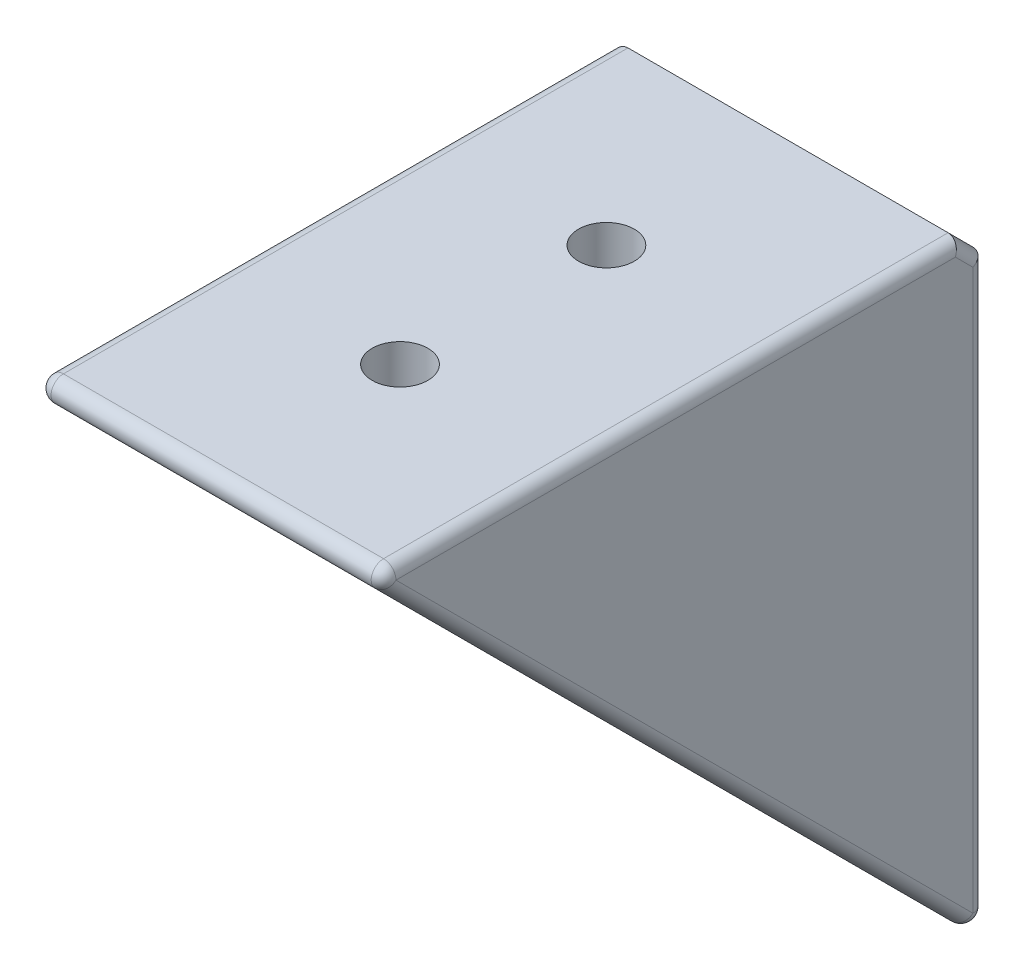
ISO-10303-21;
HEADER;
FILE_DESCRIPTION(('STEP AP214'),'2;1');
FILE_NAME('part.step','',(''),(''),'','','');
FILE_SCHEMA(('AUTOMOTIVE_DESIGN { 1 0 10303 214 1 1 1 1 }'));
ENDSEC;
DATA;
#1=APPLICATION_CONTEXT('core data for automotive mechanical design processes');
#2=APPLICATION_PROTOCOL_DEFINITION('international standard','automotive_design',2000,#1);
#3=PRODUCT_CONTEXT('',#1,'mechanical');
#4=PRODUCT('Part','Part','',(#3));
#5=PRODUCT_RELATED_PRODUCT_CATEGORY('part','',(#4));
#6=PRODUCT_DEFINITION_FORMATION('','',#4);
#7=PRODUCT_DEFINITION_CONTEXT('part definition',#1,'design');
#8=PRODUCT_DEFINITION('design','',#6,#7);
#9=PRODUCT_DEFINITION_SHAPE('','',#8);
#10=(LENGTH_UNIT() NAMED_UNIT(*) SI_UNIT(.MILLI.,.METRE.));
#11=(NAMED_UNIT(*) PLANE_ANGLE_UNIT() SI_UNIT($,.RADIAN.));
#12=(NAMED_UNIT(*) SI_UNIT($,.STERADIAN.) SOLID_ANGLE_UNIT());
#13=UNCERTAINTY_MEASURE_WITH_UNIT(LENGTH_MEASURE(1.E-05),#10,'distance_accuracy_value','');
#14=(GEOMETRIC_REPRESENTATION_CONTEXT(3) GLOBAL_UNCERTAINTY_ASSIGNED_CONTEXT((#13)) GLOBAL_UNIT_ASSIGNED_CONTEXT((#10,
#11,#12)) REPRESENTATION_CONTEXT('',''));
#15=CARTESIAN_POINT('',(0.,0.,0.));
#16=DIRECTION('',(0.,0.,1.));
#17=DIRECTION('',(1.,0.,0.));
#18=AXIS2_PLACEMENT_3D('',#15,#16,#17);
#19=CARTESIAN_POINT('',(13.925,0.,50.));
#20=DIRECTION('',(0.,0.707106781186548,-0.707106781186547));
#21=DIRECTION('',(0.,0.707106781186547,0.707106781186548));
#22=AXIS2_PLACEMENT_3D('',#19,#20,#21);
#23=PLANE('',#22);
#24=DIRECTION('',(0.,-0.707106781186547,-0.707106781186548));
#25=VECTOR('',#24,1.);
#26=CARTESIAN_POINT('',(-12.925,0.,50.));
#27=LINE('',#26,#25);
#28=CARTESIAN_POINT('',(-12.925,-1.70710678118655,48.2928932188135));
#29=VERTEX_POINT('',#28);
#30=CARTESIAN_POINT('',(-12.925,-48.2928932188135,1.70710678118654));
#31=VERTEX_POINT('',#30);
#32=EDGE_CURVE('E215',#29,#31,#27,.T.);
#33=ORIENTED_EDGE('',*,*,#32,.T.);
#34=DIRECTION('',(-1.,0.,0.));
#35=VECTOR('',#34,1.);
#36=CARTESIAN_POINT('',(13.925,-48.2928932188135,1.70710678118655));
#37=LINE('',#36,#35);
#38=CARTESIAN_POINT('',(12.925,-48.2928932188135,1.70710678118654));
#39=VERTEX_POINT('',#38);
#40=EDGE_CURVE('E219',#31,#39,#37,.F.);
#41=ORIENTED_EDGE('',*,*,#40,.T.);
#42=DIRECTION('',(0.,-0.707106781186547,-0.707106781186548));
#43=VECTOR('',#42,1.);
#44=CARTESIAN_POINT('',(12.925,0.,50.));
#45=LINE('',#44,#43);
#46=CARTESIAN_POINT('',(12.925,-1.70710678118655,48.2928932188135));
#47=VERTEX_POINT('',#46);
#48=EDGE_CURVE('E212',#39,#47,#45,.F.);
#49=ORIENTED_EDGE('',*,*,#48,.T.);
#50=DIRECTION('',(-1.,0.,0.));
#51=VECTOR('',#50,1.);
#52=CARTESIAN_POINT('',(13.925,-1.70710678118655,48.2928932188135));
#53=LINE('',#52,#51);
#54=EDGE_CURVE('E209',#47,#29,#53,.T.);
#55=ORIENTED_EDGE('',*,*,#54,.T.);
#56=EDGE_LOOP('',(#33,#41,#49,#55));
#57=FACE_BOUND('',#56,.T.);
#58=DIRECTION('',(0.,-0.707106781186547,-0.707106781186548));
#59=VECTOR('',#58,1.);
#60=CARTESIAN_POINT('',(4.25,-33.3333333333333,16.6666666666667));
#61=LINE('',#60,#59);
#62=CARTESIAN_POINT('',(4.25,-16.6666666666667,33.3333333333333));
#63=VERTEX_POINT('',#62);
#64=CARTESIAN_POINT('',(4.25,-33.3333333333333,16.6666666666667));
#65=VERTEX_POINT('',#64);
#66=EDGE_CURVE('E145',#63,#65,#61,.T.);
#67=ORIENTED_EDGE('',*,*,#66,.T.);
#68=CARTESIAN_POINT('',(0.,-33.3333333333333,16.6666666666667));
#69=DIRECTION('',(0.,0.707106781186548,-0.707106781186547));
#70=DIRECTION('',(0.,-0.707106781186547,-0.707106781186548));
#71=AXIS2_PLACEMENT_3D('',#68,#69,#70);
#72=ELLIPSE('',#71,6.01040764008566,4.25);
#73=CARTESIAN_POINT('',(-4.25,-33.3333333333333,16.6666666666667));
#74=VERTEX_POINT('',#73);
#75=EDGE_CURVE('E159',#65,#74,#72,.T.);
#76=ORIENTED_EDGE('',*,*,#75,.T.);
#77=DIRECTION('',(0.,-0.707106781186547,-0.707106781186548));
#78=VECTOR('',#77,1.);
#79=CARTESIAN_POINT('',(-4.25,-33.3333333333333,16.6666666666667));
#80=LINE('',#79,#78);
#81=CARTESIAN_POINT('',(-4.25,-16.6666666666667,33.3333333333333));
#82=VERTEX_POINT('',#81);
#83=EDGE_CURVE('E327',#82,#74,#80,.T.);
#84=ORIENTED_EDGE('',*,*,#83,.F.);
#85=CARTESIAN_POINT('',(0.,-16.6666666666667,33.3333333333333));
#86=DIRECTION('',(0.,0.707106781186548,-0.707106781186547));
#87=DIRECTION('',(0.,-0.707106781186547,-0.707106781186548));
#88=AXIS2_PLACEMENT_3D('',#85,#86,#87);
#89=ELLIPSE('',#88,6.01040764008566,4.25);
#90=EDGE_CURVE('E161',#82,#63,#89,.T.);
#91=ORIENTED_EDGE('',*,*,#90,.T.);
#92=EDGE_LOOP('',(#67,#76,#84,#91));
#93=FACE_BOUND('',#92,.T.);
#94=ADVANCED_FACE('F47',(#57,#93),#23,.F.);
#95=CARTESIAN_POINT('',(0.,-67.,16.6666666666667));
#96=DIRECTION('',(0.,1.,0.));
#97=DIRECTION('',(0.,0.,1.));
#98=AXIS2_PLACEMENT_3D('',#95,#96,#97);
#99=CYLINDRICAL_SURFACE('',#98,4.25);
#100=CARTESIAN_POINT('',(0.,-33.3333333333333,16.6666666666667));
#101=DIRECTION('',(0.,-0.707106781186547,-0.707106781186548));
#102=DIRECTION('',(0.,0.707106781186548,-0.707106781186547));
#103=AXIS2_PLACEMENT_3D('',#100,#101,#102);
#104=ELLIPSE('',#103,6.01040764008565,4.25);
#105=EDGE_CURVE('E167',#74,#65,#104,.T.);
#106=ORIENTED_EDGE('',*,*,#105,.T.);
#107=DIRECTION('',(0.,1.,0.));
#108=VECTOR('',#107,1.);
#109=CARTESIAN_POINT('',(4.25,-16.6666666666667,16.6666666666667));
#110=LINE('',#109,#108);
#111=CARTESIAN_POINT('',(4.25,-16.6666666666667,16.6666666666667));
#112=VERTEX_POINT('',#111);
#113=EDGE_CURVE('E142',#65,#112,#110,.T.);
#114=ORIENTED_EDGE('',*,*,#113,.T.);
#115=CARTESIAN_POINT('',(0.,-16.6666666666667,16.6666666666667));
#116=DIRECTION('',(0.,0.707106781186548,-0.707106781186547));
#117=DIRECTION('',(0.,-0.707106781186547,-0.707106781186548));
#118=AXIS2_PLACEMENT_3D('',#115,#116,#117);
#119=ELLIPSE('',#118,6.01040764008566,4.25);
#120=CARTESIAN_POINT('',(-4.25,-16.6666666666667,16.6666666666667));
#121=VERTEX_POINT('',#120);
#122=EDGE_CURVE('E348',#112,#121,#119,.T.);
#123=ORIENTED_EDGE('',*,*,#122,.T.);
#124=DIRECTION('',(0.,1.,0.));
#125=VECTOR('',#124,1.);
#126=CARTESIAN_POINT('',(-4.25,-16.6666666666667,16.6666666666667));
#127=LINE('',#126,#125);
#128=EDGE_CURVE('E169',#74,#121,#127,.T.);
#129=ORIENTED_EDGE('',*,*,#128,.F.);
#130=EDGE_LOOP('',(#106,#114,#123,#129));
#131=FACE_BOUND('',#130,.T.);
#132=ADVANCED_FACE('F168',(#131),#99,.F.);
#133=CARTESIAN_POINT('',(0.,-16.6666666666667,67.));
#134=DIRECTION('',(0.,0.,-1.));
#135=DIRECTION('',(-1.,0.,0.));
#136=AXIS2_PLACEMENT_3D('',#133,#134,#135);
#137=CYLINDRICAL_SURFACE('',#136,4.25);
#138=CARTESIAN_POINT('',(0.,-16.6666666666667,16.6666666666667));
#139=DIRECTION('',(0.,0.707106781186548,-0.707106781186547));
#140=DIRECTION('',(0.,-0.707106781186547,-0.707106781186548));
#141=AXIS2_PLACEMENT_3D('',#138,#139,#140);
#142=ELLIPSE('',#141,6.01040764008566,4.25);
#143=EDGE_CURVE('E351',#112,#121,#142,.F.);
#144=ORIENTED_EDGE('',*,*,#143,.F.);
#145=DIRECTION('',(0.,0.,1.));
#146=VECTOR('',#145,1.);
#147=CARTESIAN_POINT('',(4.25,-16.6666666666667,33.3333333333333));
#148=LINE('',#147,#146);
#149=EDGE_CURVE('E147',#112,#63,#148,.T.);
#150=ORIENTED_EDGE('',*,*,#149,.T.);
#151=CARTESIAN_POINT('',(0.,-16.6666666666667,33.3333333333333));
#152=DIRECTION('',(0.,-0.707106781186547,-0.707106781186548));
#153=DIRECTION('',(0.,0.707106781186548,-0.707106781186547));
#154=AXIS2_PLACEMENT_3D('',#151,#152,#153);
#155=ELLIPSE('',#154,6.01040764008565,4.25);
#156=EDGE_CURVE('E172',#82,#63,#155,.T.);
#157=ORIENTED_EDGE('',*,*,#156,.F.);
#158=DIRECTION('',(0.,0.,1.));
#159=VECTOR('',#158,1.);
#160=CARTESIAN_POINT('',(-4.25,-16.6666666666667,33.3333333333333));
#161=LINE('',#160,#159);
#162=EDGE_CURVE('E163',#121,#82,#161,.T.);
#163=ORIENTED_EDGE('',*,*,#162,.F.);
#164=EDGE_LOOP('',(#144,#150,#157,#163));
#165=FACE_BOUND('',#164,.T.);
#166=ADVANCED_FACE('F408',(#165),#137,.F.);
#167=CARTESIAN_POINT('',(0.,-16.6666666666667,5.));
#168=DIRECTION('',(0.,0.,-1.));
#169=DIRECTION('',(-1.,0.,0.));
#170=AXIS2_PLACEMENT_3D('',#167,#168,#169);
#171=CIRCLE('',#170,4.25);
#172=CARTESIAN_POINT('',(-4.25,-16.6666666666667,5.));
#173=VERTEX_POINT('',#172);
#174=EDGE_CURVE('E364',#173,#173,#171,.T.);
#175=ORIENTED_EDGE('',*,*,#174,.T.);
#176=EDGE_LOOP('',(#175));
#177=FACE_BOUND('',#176,.T.);
#178=ORIENTED_EDGE('',*,*,#122,.F.);
#179=CARTESIAN_POINT('',(0.,-16.6666666666667,16.6666666666667));
#180=DIRECTION('',(0.,-0.707106781186547,-0.707106781186548));
#181=DIRECTION('',(0.,0.707106781186548,-0.707106781186547));
#182=AXIS2_PLACEMENT_3D('',#179,#180,#181);
#183=ELLIPSE('',#182,6.01040764008565,4.25);
#184=EDGE_CURVE('E204',#121,#112,#183,.T.);
#185=ORIENTED_EDGE('',*,*,#184,.F.);
#186=EDGE_LOOP('',(#178,#185));
#187=FACE_BOUND('',#186,.T.);
#188=ADVANCED_FACE('F522',(#177,#187),#137,.F.);
#189=CARTESIAN_POINT('',(0.,-33.3333333333333,67.));
#190=DIRECTION('',(0.,0.,-1.));
#191=DIRECTION('',(-1.,0.,0.));
#192=AXIS2_PLACEMENT_3D('',#189,#190,#191);
#193=CYLINDRICAL_SURFACE('',#192,4.25);
#194=CARTESIAN_POINT('',(0.,-33.3333333333333,5.));
#195=DIRECTION('',(0.,0.,-1.));
#196=DIRECTION('',(-1.,0.,0.));
#197=AXIS2_PLACEMENT_3D('',#194,#195,#196);
#198=CIRCLE('',#197,4.25);
#199=CARTESIAN_POINT('',(-4.25,-33.3333333333333,5.));
#200=VERTEX_POINT('',#199);
#201=EDGE_CURVE('E363',#200,#200,#198,.T.);
#202=ORIENTED_EDGE('',*,*,#201,.T.);
#203=EDGE_LOOP('',(#202));
#204=FACE_BOUND('',#203,.T.);
#205=ORIENTED_EDGE('',*,*,#105,.F.);
#206=ORIENTED_EDGE('',*,*,#75,.F.);
#207=EDGE_LOOP('',(#205,#206));
#208=FACE_BOUND('',#207,.T.);
#209=ADVANCED_FACE('F175',(#204,#208),#193,.F.);
#210=CARTESIAN_POINT('',(13.925,0.,0.));
#211=DIRECTION('',(0.,-1.,0.));
#212=DIRECTION('',(0.,0.,-1.));
#213=AXIS2_PLACEMENT_3D('',#210,#211,#212);
#214=PLANE('',#213);
#215=DIRECTION('',(-1.,0.,0.));
#216=VECTOR('',#215,1.);
#217=CARTESIAN_POINT('',(13.925,0.,1.99999999999999));
#218=LINE('',#217,#216);
#219=CARTESIAN_POINT('',(12.925,0.,1.99999999999999));
#220=VERTEX_POINT('',#219);
#221=CARTESIAN_POINT('',(-12.925,0.,1.99999999999999));
#222=VERTEX_POINT('',#221);
#223=EDGE_CURVE('E188',#220,#222,#218,.T.);
#224=ORIENTED_EDGE('',*,*,#223,.T.);
#225=DIRECTION('',(0.,0.,1.));
#226=VECTOR('',#225,1.);
#227=CARTESIAN_POINT('',(-12.925,0.,0.));
#228=LINE('',#227,#226);
#229=CARTESIAN_POINT('',(-12.925,0.,47.5857864376269));
#230=VERTEX_POINT('',#229);
#231=EDGE_CURVE('E257',#222,#230,#228,.T.);
#232=ORIENTED_EDGE('',*,*,#231,.T.);
#233=DIRECTION('',(-1.,0.,0.));
#234=VECTOR('',#233,1.);
#235=CARTESIAN_POINT('',(13.925,0.,47.5857864376269));
#236=LINE('',#235,#234);
#237=CARTESIAN_POINT('',(12.925,0.,47.5857864376269));
#238=VERTEX_POINT('',#237);
#239=EDGE_CURVE('E251',#230,#238,#236,.F.);
#240=ORIENTED_EDGE('',*,*,#239,.T.);
#241=DIRECTION('',(0.,0.,1.));
#242=VECTOR('',#241,1.);
#243=CARTESIAN_POINT('',(12.925,0.,1.99999999999999));
#244=LINE('',#243,#242);
#245=EDGE_CURVE('E254',#238,#220,#244,.F.);
#246=ORIENTED_EDGE('',*,*,#245,.T.);
#247=EDGE_LOOP('',(#224,#232,#240,#246));
#248=FACE_BOUND('',#247,.T.);
#249=CARTESIAN_POINT('',(0.,0.,16.6666666666667));
#250=DIRECTION('',(0.,1.,0.));
#251=DIRECTION('',(0.,0.,1.));
#252=AXIS2_PLACEMENT_3D('',#249,#250,#251);
#253=CIRCLE('',#252,2.24999999999999);
#254=CARTESIAN_POINT('',(0.,0.,18.9166666666667));
#255=VERTEX_POINT('',#254);
#256=EDGE_CURVE('E355',#255,#255,#253,.T.);
#257=ORIENTED_EDGE('',*,*,#256,.F.);
#258=EDGE_LOOP('',(#257));
#259=FACE_BOUND('',#258,.T.);
#260=CARTESIAN_POINT('',(0.,0.,33.3333333333333));
#261=DIRECTION('',(0.,1.,0.));
#262=DIRECTION('',(0.,0.,1.));
#263=AXIS2_PLACEMENT_3D('',#260,#261,#262);
#264=CIRCLE('',#263,2.24999999999999);
#265=CARTESIAN_POINT('',(0.,0.,35.5833333333333));
#266=VERTEX_POINT('',#265);
#267=EDGE_CURVE('E359',#266,#266,#264,.T.);
#268=ORIENTED_EDGE('',*,*,#267,.F.);
#269=EDGE_LOOP('',(#268));
#270=FACE_BOUND('',#269,.T.);
#271=ADVANCED_FACE('F415',(#248,#259,#270),#214,.F.);
#272=CARTESIAN_POINT('',(13.925,-50.,0.));
#273=DIRECTION('',(0.,0.,1.));
#274=DIRECTION('',(1.,0.,0.));
#275=AXIS2_PLACEMENT_3D('',#272,#273,#274);
#276=PLANE('',#275);
#277=DIRECTION('',(-1.,0.,0.));
#278=VECTOR('',#277,1.);
#279=CARTESIAN_POINT('',(13.925,-47.5857864376269,0.));
#280=LINE('',#279,#278);
#281=CARTESIAN_POINT('',(12.925,-47.5857864376269,0.));
#282=VERTEX_POINT('',#281);
#283=CARTESIAN_POINT('',(-12.925,-47.5857864376269,0.));
#284=VERTEX_POINT('',#283);
#285=EDGE_CURVE('E235',#282,#284,#280,.T.);
#286=ORIENTED_EDGE('',*,*,#285,.T.);
#287=DIRECTION('',(0.,1.,0.));
#288=VECTOR('',#287,1.);
#289=CARTESIAN_POINT('',(-12.925,-50.,0.));
#290=LINE('',#289,#288);
#291=CARTESIAN_POINT('',(-12.925,-2.00000000000001,0.));
#292=VERTEX_POINT('',#291);
#293=EDGE_CURVE('E241',#284,#292,#290,.T.);
#294=ORIENTED_EDGE('',*,*,#293,.T.);
#295=DIRECTION('',(1.,0.,0.));
#296=VECTOR('',#295,1.);
#297=CARTESIAN_POINT('',(13.925,-2.00000000000001,0.));
#298=LINE('',#297,#296);
#299=CARTESIAN_POINT('',(12.925,-2.00000000000001,0.));
#300=VERTEX_POINT('',#299);
#301=EDGE_CURVE('E173',#292,#300,#298,.T.);
#302=ORIENTED_EDGE('',*,*,#301,.T.);
#303=DIRECTION('',(0.,1.,0.));
#304=VECTOR('',#303,1.);
#305=CARTESIAN_POINT('',(12.925,-50.,0.));
#306=LINE('',#305,#304);
#307=EDGE_CURVE('E238',#300,#282,#306,.F.);
#308=ORIENTED_EDGE('',*,*,#307,.T.);
#309=EDGE_LOOP('',(#286,#294,#302,#308));
#310=FACE_BOUND('',#309,.T.);
#311=CARTESIAN_POINT('',(0.,-33.3333333333333,0.));
#312=DIRECTION('',(0.,0.,-1.));
#313=DIRECTION('',(-1.,0.,0.));
#314=AXIS2_PLACEMENT_3D('',#311,#312,#313);
#315=CIRCLE('',#314,2.24999999999999);
#316=CARTESIAN_POINT('',(-2.24999999999999,-33.3333333333333,0.));
#317=VERTEX_POINT('',#316);
#318=EDGE_CURVE('E192',#317,#317,#315,.T.);
#319=ORIENTED_EDGE('',*,*,#318,.F.);
#320=EDGE_LOOP('',(#319));
#321=FACE_BOUND('',#320,.T.);
#322=CARTESIAN_POINT('',(0.,-16.6666666666667,0.));
#323=DIRECTION('',(0.,0.,-1.));
#324=DIRECTION('',(-1.,0.,0.));
#325=AXIS2_PLACEMENT_3D('',#322,#323,#324);
#326=CIRCLE('',#325,2.24999999999999);
#327=CARTESIAN_POINT('',(-2.24999999999999,-16.6666666666667,0.));
#328=VERTEX_POINT('',#327);
#329=EDGE_CURVE('E181',#328,#328,#326,.T.);
#330=ORIENTED_EDGE('',*,*,#329,.F.);
#331=EDGE_LOOP('',(#330));
#332=FACE_BOUND('',#331,.T.);
#333=ADVANCED_FACE('F417',(#310,#321,#332),#276,.F.);
#334=CARTESIAN_POINT('',(13.925,0.,0.));
#335=DIRECTION('',(1.,0.,0.));
#336=DIRECTION('',(0.,0.,-1.));
#337=AXIS2_PLACEMENT_3D('',#334,#335,#336);
#338=PLANE('',#337);
#339=DIRECTION('',(0.,0.,1.));
#340=VECTOR('',#339,1.);
#341=CARTESIAN_POINT('',(13.925,-1.00000000000001,50.));
#342=LINE('',#341,#340);
#343=CARTESIAN_POINT('',(13.925,-1.,2.41421356237309));
#344=VERTEX_POINT('',#343);
#345=CARTESIAN_POINT('',(13.925,-1.00000000000001,47.5857864376269));
#346=VERTEX_POINT('',#345);
#347=EDGE_CURVE('E57',#344,#346,#342,.T.);
#348=ORIENTED_EDGE('',*,*,#347,.T.);
#349=DIRECTION('',(0.,-0.707106781186547,-0.707106781186548));
#350=VECTOR('',#349,1.);
#351=CARTESIAN_POINT('',(13.925,-49.2928932188135,-0.707106781186548));
#352=LINE('',#351,#350);
#353=CARTESIAN_POINT('',(13.925,-47.5857864376269,1.));
#354=VERTEX_POINT('',#353);
#355=EDGE_CURVE('E11',#346,#354,#352,.T.);
#356=ORIENTED_EDGE('',*,*,#355,.T.);
#357=DIRECTION('',(0.,1.,0.));
#358=VECTOR('',#357,1.);
#359=CARTESIAN_POINT('',(13.925,-2.00000000000001,1.));
#360=LINE('',#359,#358);
#361=CARTESIAN_POINT('',(13.925,-2.4142135623731,1.));
#362=VERTEX_POINT('',#361);
#363=EDGE_CURVE('E260',#354,#362,#360,.T.);
#364=ORIENTED_EDGE('',*,*,#363,.T.);
#365=DIRECTION('',(0.,-0.70710678118655,-0.707106781186545));
#366=VECTOR('',#365,1.);
#367=CARTESIAN_POINT('',(13.925,-1.70710678118654,1.70710678118655));
#368=LINE('',#367,#366);
#369=EDGE_CURVE('E68',#362,#344,#368,.F.);
#370=ORIENTED_EDGE('',*,*,#369,.T.);
#371=EDGE_LOOP('',(#348,#356,#364,#370));
#372=FACE_BOUND('',#371,.T.);
#373=ADVANCED_FACE('F421',(#372),#338,.T.);
#374=CARTESIAN_POINT('',(-13.925,0.,0.));
#375=DIRECTION('',(1.,0.,0.));
#376=DIRECTION('',(0.,0.,-1.));
#377=AXIS2_PLACEMENT_3D('',#374,#375,#376);
#378=PLANE('',#377);
#379=DIRECTION('',(0.,1.,0.));
#380=VECTOR('',#379,1.);
#381=CARTESIAN_POINT('',(-13.925,0.,1.));
#382=LINE('',#381,#380);
#383=CARTESIAN_POINT('',(-13.925,-2.4142135623731,1.));
#384=VERTEX_POINT('',#383);
#385=CARTESIAN_POINT('',(-13.925,-47.5857864376269,1.));
#386=VERTEX_POINT('',#385);
#387=EDGE_CURVE('E228',#384,#386,#382,.F.);
#388=ORIENTED_EDGE('',*,*,#387,.T.);
#389=DIRECTION('',(0.,-0.707106781186547,-0.707106781186548));
#390=VECTOR('',#389,1.);
#391=CARTESIAN_POINT('',(-13.925,-24.2928932188135,24.2928932188135));
#392=LINE('',#391,#390);
#393=CARTESIAN_POINT('',(-13.925,-1.00000000000001,47.5857864376269));
#394=VERTEX_POINT('',#393);
#395=EDGE_CURVE('E231',#386,#394,#392,.F.);
#396=ORIENTED_EDGE('',*,*,#395,.T.);
#397=DIRECTION('',(0.,0.,1.));
#398=VECTOR('',#397,1.);
#399=CARTESIAN_POINT('',(-13.925,-1.,0.));
#400=LINE('',#399,#398);
#401=CARTESIAN_POINT('',(-13.925,-1.,2.41421356237309));
#402=VERTEX_POINT('',#401);
#403=EDGE_CURVE('E222',#394,#402,#400,.F.);
#404=ORIENTED_EDGE('',*,*,#403,.T.);
#405=DIRECTION('',(0.,0.70710678118655,0.707106781186545));
#406=VECTOR('',#405,1.);
#407=CARTESIAN_POINT('',(-13.925,-2.70710678118655,0.70710678118655));
#408=LINE('',#407,#406);
#409=EDGE_CURVE('E225',#402,#384,#408,.F.);
#410=ORIENTED_EDGE('',*,*,#409,.T.);
#411=EDGE_LOOP('',(#388,#396,#404,#410));
#412=FACE_BOUND('',#411,.T.);
#413=ADVANCED_FACE('F413',(#412),#378,.F.);
#414=CARTESIAN_POINT('',(0.,-33.3333333333333,0.));
#415=DIRECTION('',(0.,0.,-1.));
#416=DIRECTION('',(-1.,0.,0.));
#417=AXIS2_PLACEMENT_3D('',#414,#415,#416);
#418=CYLINDRICAL_SURFACE('',#417,2.24999999999999);
#419=CARTESIAN_POINT('',(0.,-33.3333333333333,5.));
#420=DIRECTION('',(0.,0.,-1.));
#421=DIRECTION('',(-1.,0.,0.));
#422=AXIS2_PLACEMENT_3D('',#419,#420,#421);
#423=CIRCLE('',#422,2.24999999999999);
#424=CARTESIAN_POINT('',(-2.24999999999999,-33.3333333333333,5.));
#425=VERTEX_POINT('',#424);
#426=EDGE_CURVE('E177',#425,#425,#423,.F.);
#427=ORIENTED_EDGE('',*,*,#426,.T.);
#428=EDGE_LOOP('',(#427));
#429=FACE_BOUND('',#428,.T.);
#430=ORIENTED_EDGE('',*,*,#318,.T.);
#431=EDGE_LOOP('',(#430));
#432=FACE_BOUND('',#431,.T.);
#433=ADVANCED_FACE('F395',(#429,#432),#418,.F.);
#434=CARTESIAN_POINT('',(0.,-16.6666666666667,0.));
#435=DIRECTION('',(0.,0.,-1.));
#436=DIRECTION('',(-1.,0.,0.));
#437=AXIS2_PLACEMENT_3D('',#434,#435,#436);
#438=CYLINDRICAL_SURFACE('',#437,2.24999999999999);
#439=CARTESIAN_POINT('',(0.,-16.6666666666667,5.));
#440=DIRECTION('',(0.,0.,-1.));
#441=DIRECTION('',(-1.,0.,0.));
#442=AXIS2_PLACEMENT_3D('',#439,#440,#441);
#443=CIRCLE('',#442,2.24999999999999);
#444=CARTESIAN_POINT('',(-2.24999999999999,-16.6666666666667,5.));
#445=VERTEX_POINT('',#444);
#446=EDGE_CURVE('E184',#445,#445,#443,.F.);
#447=ORIENTED_EDGE('',*,*,#446,.T.);
#448=EDGE_LOOP('',(#447));
#449=FACE_BOUND('',#448,.T.);
#450=ORIENTED_EDGE('',*,*,#329,.T.);
#451=EDGE_LOOP('',(#450));
#452=FACE_BOUND('',#451,.T.);
#453=ADVANCED_FACE('F380',(#449,#452),#438,.F.);
#454=CARTESIAN_POINT('',(0.,-16.6666666666667,5.));
#455=DIRECTION('',(0.,0.,-1.));
#456=DIRECTION('',(-1.,0.,0.));
#457=AXIS2_PLACEMENT_3D('',#454,#455,#456);
#458=PLANE('',#457);
#459=ORIENTED_EDGE('',*,*,#174,.F.);
#460=EDGE_LOOP('',(#459));
#461=FACE_BOUND('',#460,.T.);
#462=ORIENTED_EDGE('',*,*,#446,.F.);
#463=EDGE_LOOP('',(#462));
#464=FACE_BOUND('',#463,.T.);
#465=ADVANCED_FACE('F383',(#461,#464),#458,.F.);
#466=CARTESIAN_POINT('',(0.,-33.3333333333333,5.));
#467=DIRECTION('',(0.,0.,-1.));
#468=DIRECTION('',(-1.,0.,0.));
#469=AXIS2_PLACEMENT_3D('',#466,#467,#468);
#470=PLANE('',#469);
#471=ORIENTED_EDGE('',*,*,#201,.F.);
#472=EDGE_LOOP('',(#471));
#473=FACE_BOUND('',#472,.T.);
#474=ORIENTED_EDGE('',*,*,#426,.F.);
#475=EDGE_LOOP('',(#474));
#476=FACE_BOUND('',#475,.T.);
#477=ADVANCED_FACE('F385',(#473,#476),#470,.F.);
#478=CARTESIAN_POINT('',(13.925,0.,1.99999999999999));
#479=DIRECTION('',(0.,-0.707106781186545,0.70710678118655));
#480=DIRECTION('',(-1.,0.,0.));
#481=AXIS2_PLACEMENT_3D('',#478,#479,#480);
#482=PLANE('',#481);
#483=ORIENTED_EDGE('',*,*,#301,.F.);
#484=DIRECTION('',(0.,-0.70710678118655,-0.707106781186545));
#485=VECTOR('',#484,1.);
#486=CARTESIAN_POINT('',(-12.925,0.,1.99999999999999));
#487=LINE('',#486,#485);
#488=EDGE_CURVE('E248',#292,#222,#487,.F.);
#489=ORIENTED_EDGE('',*,*,#488,.T.);
#490=ORIENTED_EDGE('',*,*,#223,.F.);
#491=DIRECTION('',(0.,0.70710678118655,0.707106781186545));
#492=VECTOR('',#491,1.);
#493=CARTESIAN_POINT('',(12.925,0.,1.99999999999999));
#494=LINE('',#493,#492);
#495=EDGE_CURVE('E245',#220,#300,#494,.F.);
#496=ORIENTED_EDGE('',*,*,#495,.T.);
#497=EDGE_LOOP('',(#483,#489,#490,#496));
#498=FACE_BOUND('',#497,.T.);
#499=ADVANCED_FACE('F392',(#498),#482,.F.);
#500=CARTESIAN_POINT('',(0.,0.,33.3333333333333));
#501=DIRECTION('',(0.,1.,0.));
#502=DIRECTION('',(0.,0.,1.));
#503=AXIS2_PLACEMENT_3D('',#500,#501,#502);
#504=CYLINDRICAL_SURFACE('',#503,2.24999999999999);
#505=CARTESIAN_POINT('',(0.,-5.00000000000001,33.3333333333333));
#506=DIRECTION('',(0.,1.,0.));
#507=DIRECTION('',(0.,0.,1.));
#508=AXIS2_PLACEMENT_3D('',#505,#506,#507);
#509=CIRCLE('',#508,2.24999999999999);
#510=CARTESIAN_POINT('',(0.,-5.00000000000001,35.5833333333333));
#511=VERTEX_POINT('',#510);
#512=EDGE_CURVE('E200',#511,#511,#509,.F.);
#513=ORIENTED_EDGE('',*,*,#512,.T.);
#514=EDGE_LOOP('',(#513));
#515=FACE_BOUND('',#514,.T.);
#516=ORIENTED_EDGE('',*,*,#267,.T.);
#517=EDGE_LOOP('',(#516));
#518=FACE_BOUND('',#517,.T.);
#519=ADVANCED_FACE('F428',(#515,#518),#504,.F.);
#520=CARTESIAN_POINT('',(0.,0.,16.6666666666667));
#521=DIRECTION('',(0.,1.,0.));
#522=DIRECTION('',(0.,0.,1.));
#523=AXIS2_PLACEMENT_3D('',#520,#521,#522);
#524=CYLINDRICAL_SURFACE('',#523,2.24999999999999);
#525=CARTESIAN_POINT('',(0.,-5.,16.6666666666667));
#526=DIRECTION('',(0.,1.,0.));
#527=DIRECTION('',(0.,0.,1.));
#528=AXIS2_PLACEMENT_3D('',#525,#526,#527);
#529=CIRCLE('',#528,2.24999999999999);
#530=CARTESIAN_POINT('',(0.,-5.,18.9166666666667));
#531=VERTEX_POINT('',#530);
#532=EDGE_CURVE('E196',#531,#531,#529,.F.);
#533=ORIENTED_EDGE('',*,*,#532,.T.);
#534=EDGE_LOOP('',(#533));
#535=FACE_BOUND('',#534,.T.);
#536=ORIENTED_EDGE('',*,*,#256,.T.);
#537=EDGE_LOOP('',(#536));
#538=FACE_BOUND('',#537,.T.);
#539=ADVANCED_FACE('F548',(#535,#538),#524,.F.);
#540=CARTESIAN_POINT('',(0.,-5.,16.6666666666667));
#541=DIRECTION('',(0.,1.,0.));
#542=DIRECTION('',(-1.,0.,0.));
#543=AXIS2_PLACEMENT_3D('',#540,#541,#542);
#544=PLANE('',#543);
#545=CARTESIAN_POINT('',(0.,-5.,16.6666666666667));
#546=DIRECTION('',(0.,-1.,0.));
#547=DIRECTION('',(-1.,0.,0.));
#548=AXIS2_PLACEMENT_3D('',#545,#546,#547);
#549=CIRCLE('',#548,4.25);
#550=CARTESIAN_POINT('',(-4.25,-5.,16.6666666666667));
#551=VERTEX_POINT('',#550);
#552=EDGE_CURVE('E201',#551,#551,#549,.T.);
#553=ORIENTED_EDGE('',*,*,#552,.T.);
#554=EDGE_LOOP('',(#553));
#555=FACE_BOUND('',#554,.T.);
#556=ORIENTED_EDGE('',*,*,#532,.F.);
#557=EDGE_LOOP('',(#556));
#558=FACE_BOUND('',#557,.T.);
#559=ADVANCED_FACE('F539',(#555,#558),#544,.F.);
#560=ORIENTED_EDGE('',*,*,#552,.F.);
#561=EDGE_LOOP('',(#560));
#562=FACE_BOUND('',#561,.T.);
#563=ORIENTED_EDGE('',*,*,#143,.T.);
#564=ORIENTED_EDGE('',*,*,#184,.T.);
#565=EDGE_LOOP('',(#563,#564));
#566=FACE_BOUND('',#565,.T.);
#567=ADVANCED_FACE('F410',(#562,#566),#99,.F.);
#568=CARTESIAN_POINT('',(0.,-67.,33.3333333333333));
#569=DIRECTION('',(0.,1.,0.));
#570=DIRECTION('',(0.,0.,1.));
#571=AXIS2_PLACEMENT_3D('',#568,#569,#570);
#572=CYLINDRICAL_SURFACE('',#571,4.25);
#573=CARTESIAN_POINT('',(0.,-5.00000000000001,33.3333333333333));
#574=DIRECTION('',(0.,-1.,0.));
#575=DIRECTION('',(-1.,0.,0.));
#576=AXIS2_PLACEMENT_3D('',#573,#574,#575);
#577=CIRCLE('',#576,4.25);
#578=CARTESIAN_POINT('',(-4.25,-5.00000000000001,33.3333333333333));
#579=VERTEX_POINT('',#578);
#580=EDGE_CURVE('E342',#579,#579,#577,.T.);
#581=ORIENTED_EDGE('',*,*,#580,.F.);
#582=EDGE_LOOP('',(#581));
#583=FACE_BOUND('',#582,.T.);
#584=ORIENTED_EDGE('',*,*,#90,.F.);
#585=ORIENTED_EDGE('',*,*,#156,.T.);
#586=EDGE_LOOP('',(#584,#585));
#587=FACE_BOUND('',#586,.T.);
#588=ADVANCED_FACE('F538',(#583,#587),#572,.F.);
#589=CARTESIAN_POINT('',(0.,-5.00000000000001,33.3333333333333));
#590=DIRECTION('',(0.,1.,0.));
#591=DIRECTION('',(-1.,0.,0.));
#592=AXIS2_PLACEMENT_3D('',#589,#590,#591);
#593=PLANE('',#592);
#594=ORIENTED_EDGE('',*,*,#580,.T.);
#595=EDGE_LOOP('',(#594));
#596=FACE_BOUND('',#595,.T.);
#597=ORIENTED_EDGE('',*,*,#512,.F.);
#598=EDGE_LOOP('',(#597));
#599=FACE_BOUND('',#598,.T.);
#600=ADVANCED_FACE('F544',(#596,#599),#593,.F.);
#601=CARTESIAN_POINT('',(-4.25,0.,0.));
#602=DIRECTION('',(-1.,0.,0.));
#603=DIRECTION('',(0.,0.,1.));
#604=AXIS2_PLACEMENT_3D('',#601,#602,#603);
#605=PLANE('',#604);
#606=ORIENTED_EDGE('',*,*,#83,.T.);
#607=ORIENTED_EDGE('',*,*,#128,.T.);
#608=ORIENTED_EDGE('',*,*,#162,.T.);
#609=EDGE_LOOP('',(#606,#607,#608));
#610=FACE_BOUND('',#609,.T.);
#611=ADVANCED_FACE('F484',(#610),#605,.F.);
#612=CARTESIAN_POINT('',(4.25,0.,0.));
#613=DIRECTION('',(-1.,0.,0.));
#614=DIRECTION('',(0.,0.,1.));
#615=AXIS2_PLACEMENT_3D('',#612,#613,#614);
#616=PLANE('',#615);
#617=ORIENTED_EDGE('',*,*,#66,.F.);
#618=ORIENTED_EDGE('',*,*,#149,.F.);
#619=ORIENTED_EDGE('',*,*,#113,.F.);
#620=EDGE_LOOP('',(#617,#618,#619));
#621=FACE_BOUND('',#620,.T.);
#622=ADVANCED_FACE('F144',(#621),#616,.T.);
#623=CARTESIAN_POINT('',(12.925,-1.70710678118654,1.70710678118655));
#624=DIRECTION('',(0.,-0.70710678118655,-0.707106781186545));
#625=DIRECTION('',(0.,0.707106781186545,-0.70710678118655));
#626=AXIS2_PLACEMENT_3D('',#623,#624,#625);
#627=CYLINDRICAL_SURFACE('',#626,1.);
#628=CARTESIAN_POINT('',(12.925,-2.4142135623731,1.));
#629=DIRECTION('',(0.,-0.923879532511287,-0.382683432365088));
#630=DIRECTION('',(0.,-0.382683432365088,0.923879532511287));
#631=AXIS2_PLACEMENT_3D('',#628,#629,#630);
#632=ELLIPSE('',#631,1.08239220029239,1.);
#633=EDGE_CURVE('E318',#300,#362,#632,.T.);
#634=ORIENTED_EDGE('',*,*,#633,.F.);
#635=ORIENTED_EDGE('',*,*,#495,.F.);
#636=CARTESIAN_POINT('',(12.925,-1.,2.41421356237309));
#637=DIRECTION('',(0.,-0.382683432365091,-0.923879532511286));
#638=DIRECTION('',(0.,-0.923879532511286,0.382683432365091));
#639=AXIS2_PLACEMENT_3D('',#636,#637,#638);
#640=ELLIPSE('',#639,1.08239220029239,1.);
#641=EDGE_CURVE('E51',#344,#220,#640,.F.);
#642=ORIENTED_EDGE('',*,*,#641,.F.);
#643=ORIENTED_EDGE('',*,*,#369,.F.);
#644=EDGE_LOOP('',(#634,#635,#642,#643));
#645=FACE_BOUND('',#644,.T.);
#646=ADVANCED_FACE('F49',(#645),#627,.T.);
#647=CARTESIAN_POINT('',(12.925,-1.,0.));
#648=DIRECTION('',(0.,0.,-1.));
#649=DIRECTION('',(0.,1.,0.));
#650=AXIS2_PLACEMENT_3D('',#647,#648,#649);
#651=CYLINDRICAL_SURFACE('',#650,1.);
#652=ORIENTED_EDGE('',*,*,#641,.T.);
#653=ORIENTED_EDGE('',*,*,#245,.F.);
#654=CARTESIAN_POINT('',(12.925,-1.00000000000001,47.5857864376269));
#655=DIRECTION('',(0.,0.,1.));
#656=DIRECTION('',(1.,0.,0.));
#657=AXIS2_PLACEMENT_3D('',#654,#655,#656);
#658=CIRCLE('',#657,1.);
#659=EDGE_CURVE('E315',#346,#238,#658,.T.);
#660=ORIENTED_EDGE('',*,*,#659,.F.);
#661=ORIENTED_EDGE('',*,*,#347,.F.);
#662=EDGE_LOOP('',(#652,#653,#660,#661));
#663=FACE_BOUND('',#662,.T.);
#664=ADVANCED_FACE('F475',(#663),#651,.T.);
#665=CARTESIAN_POINT('',(12.925,-24.2928932188135,24.2928932188135));
#666=DIRECTION('',(0.,0.707106781186547,0.707106781186548));
#667=DIRECTION('',(0.,-0.707106781186548,0.707106781186547));
#668=AXIS2_PLACEMENT_3D('',#665,#666,#667);
#669=CYLINDRICAL_SURFACE('',#668,1.);
#670=CARTESIAN_POINT('',(12.925,-47.5857864376269,0.999999999999999));
#671=DIRECTION('',(0.,-0.707106781186547,-0.707106781186548));
#672=DIRECTION('',(0.,0.707106781186548,-0.707106781186547));
#673=AXIS2_PLACEMENT_3D('',#670,#671,#672);
#674=CIRCLE('',#673,1.);
#675=EDGE_CURVE('E307',#354,#39,#674,.T.);
#676=ORIENTED_EDGE('',*,*,#675,.F.);
#677=ORIENTED_EDGE('',*,*,#355,.F.);
#678=CARTESIAN_POINT('',(12.925,-1.,47.5857864376269));
#679=DIRECTION('',(0.,0.707106781186546,0.707106781186549));
#680=DIRECTION('',(0.,-0.707106781186549,0.707106781186546));
#681=AXIS2_PLACEMENT_3D('',#678,#679,#680);
#682=CIRCLE('',#681,1.);
#683=EDGE_CURVE('E311',#47,#346,#682,.T.);
#684=ORIENTED_EDGE('',*,*,#683,.F.);
#685=ORIENTED_EDGE('',*,*,#48,.F.);
#686=EDGE_LOOP('',(#676,#677,#684,#685));
#687=FACE_BOUND('',#686,.T.);
#688=ADVANCED_FACE('F473',(#687),#669,.T.);
#689=CARTESIAN_POINT('',(12.925,0.,1.));
#690=DIRECTION('',(0.,-1.,0.));
#691=DIRECTION('',(0.,0.,-1.));
#692=AXIS2_PLACEMENT_3D('',#689,#690,#691);
#693=CYLINDRICAL_SURFACE('',#692,1.);
#694=ORIENTED_EDGE('',*,*,#633,.T.);
#695=ORIENTED_EDGE('',*,*,#363,.F.);
#696=CARTESIAN_POINT('',(12.925,-47.5857864376269,1.));
#697=DIRECTION('',(0.,-1.,0.));
#698=DIRECTION('',(0.,0.,-1.));
#699=AXIS2_PLACEMENT_3D('',#696,#697,#698);
#700=CIRCLE('',#699,1.);
#701=EDGE_CURVE('E304',#282,#354,#700,.T.);
#702=ORIENTED_EDGE('',*,*,#701,.F.);
#703=ORIENTED_EDGE('',*,*,#307,.F.);
#704=EDGE_LOOP('',(#694,#695,#702,#703));
#705=FACE_BOUND('',#704,.T.);
#706=ADVANCED_FACE('F469',(#705),#693,.T.);
#707=CARTESIAN_POINT('',(12.925,-1.00000000000001,47.5857864376269));
#708=DIRECTION('',(1.,0.,0.));
#709=DIRECTION('',(0.,0.,-1.));
#710=AXIS2_PLACEMENT_3D('',#707,#708,#709);
#711=SPHERICAL_SURFACE('',#710,1.);
#712=ORIENTED_EDGE('',*,*,#683,.T.);
#713=ORIENTED_EDGE('',*,*,#659,.T.);
#714=CARTESIAN_POINT('',(12.925,-1.00000000000001,47.5857864376269));
#715=DIRECTION('',(1.,0.,0.));
#716=DIRECTION('',(0.,0.,-1.));
#717=AXIS2_PLACEMENT_3D('',#714,#715,#716);
#718=CIRCLE('',#717,1.);
#719=EDGE_CURVE('E296',#47,#238,#718,.F.);
#720=ORIENTED_EDGE('',*,*,#719,.F.);
#721=EDGE_LOOP('',(#712,#713,#720));
#722=FACE_BOUND('',#721,.T.);
#723=ADVANCED_FACE('F465',(#722),#711,.T.);
#724=CARTESIAN_POINT('',(12.925,-47.5857864376269,1.));
#725=DIRECTION('',(1.,0.,0.));
#726=DIRECTION('',(0.,1.,0.));
#727=AXIS2_PLACEMENT_3D('',#724,#725,#726);
#728=SPHERICAL_SURFACE('',#727,1.);
#729=ORIENTED_EDGE('',*,*,#701,.T.);
#730=ORIENTED_EDGE('',*,*,#675,.T.);
#731=CARTESIAN_POINT('',(12.925,-47.5857864376269,0.999999999999996));
#732=DIRECTION('',(1.,0.,0.));
#733=DIRECTION('',(0.,0.,-1.));
#734=AXIS2_PLACEMENT_3D('',#731,#732,#733);
#735=CIRCLE('',#734,1.);
#736=EDGE_CURVE('E292',#282,#39,#735,.F.);
#737=ORIENTED_EDGE('',*,*,#736,.F.);
#738=EDGE_LOOP('',(#729,#730,#737));
#739=FACE_BOUND('',#738,.T.);
#740=ADVANCED_FACE('F461',(#739),#728,.T.);
#741=CARTESIAN_POINT('',(-12.925,-1.70710678118654,1.70710678118655));
#742=DIRECTION('',(0.,-0.70710678118655,-0.707106781186545));
#743=DIRECTION('',(0.,0.707106781186545,-0.70710678118655));
#744=AXIS2_PLACEMENT_3D('',#741,#742,#743);
#745=CYLINDRICAL_SURFACE('',#744,1.);
#746=CARTESIAN_POINT('',(-12.925,-2.4142135623731,1.));
#747=DIRECTION('',(0.,-0.923879532511287,-0.382683432365088));
#748=DIRECTION('',(0.,0.382683432365088,-0.923879532511287));
#749=AXIS2_PLACEMENT_3D('',#746,#747,#748);
#750=ELLIPSE('',#749,1.08239220029239,1.);
#751=EDGE_CURVE('E289',#384,#292,#750,.T.);
#752=ORIENTED_EDGE('',*,*,#751,.F.);
#753=ORIENTED_EDGE('',*,*,#409,.F.);
#754=CARTESIAN_POINT('',(-12.925,-1.,2.41421356237309));
#755=DIRECTION('',(0.,0.382683432365091,0.923879532511286));
#756=DIRECTION('',(0.,-0.923879532511286,0.382683432365091));
#757=AXIS2_PLACEMENT_3D('',#754,#755,#756);
#758=ELLIPSE('',#757,1.08239220029239,1.);
#759=EDGE_CURVE('E300',#222,#402,#758,.T.);
#760=ORIENTED_EDGE('',*,*,#759,.F.);
#761=ORIENTED_EDGE('',*,*,#488,.F.);
#762=EDGE_LOOP('',(#752,#753,#760,#761));
#763=FACE_BOUND('',#762,.T.);
#764=ADVANCED_FACE('F457',(#763),#745,.T.);
#765=CARTESIAN_POINT('',(-12.925,-1.,0.));
#766=DIRECTION('',(0.,0.,1.));
#767=DIRECTION('',(0.,-1.,0.));
#768=AXIS2_PLACEMENT_3D('',#765,#766,#767);
#769=CYLINDRICAL_SURFACE('',#768,1.);
#770=ORIENTED_EDGE('',*,*,#759,.T.);
#771=ORIENTED_EDGE('',*,*,#403,.F.);
#772=CARTESIAN_POINT('',(-12.925,-1.00000000000001,47.5857864376269));
#773=DIRECTION('',(0.,0.,1.));
#774=DIRECTION('',(1.,0.,0.));
#775=AXIS2_PLACEMENT_3D('',#772,#773,#774);
#776=CIRCLE('',#775,1.);
#777=EDGE_CURVE('E285',#230,#394,#776,.T.);
#778=ORIENTED_EDGE('',*,*,#777,.F.);
#779=ORIENTED_EDGE('',*,*,#231,.F.);
#780=EDGE_LOOP('',(#770,#771,#778,#779));
#781=FACE_BOUND('',#780,.T.);
#782=ADVANCED_FACE('F453',(#781),#769,.T.);
#783=CARTESIAN_POINT('',(13.925,-1.00000000000001,47.5857864376269));
#784=DIRECTION('',(-1.,0.,0.));
#785=DIRECTION('',(0.,0.,1.));
#786=AXIS2_PLACEMENT_3D('',#783,#784,#785);
#787=CYLINDRICAL_SURFACE('',#786,1.);
#788=ORIENTED_EDGE('',*,*,#719,.T.);
#789=ORIENTED_EDGE('',*,*,#239,.F.);
#790=CARTESIAN_POINT('',(-12.925,-1.,47.5857864376269));
#791=DIRECTION('',(-1.,0.,0.));
#792=DIRECTION('',(0.,0.,1.));
#793=AXIS2_PLACEMENT_3D('',#790,#791,#792);
#794=CIRCLE('',#793,1.);
#795=EDGE_CURVE('E281',#29,#230,#794,.T.);
#796=ORIENTED_EDGE('',*,*,#795,.F.);
#797=ORIENTED_EDGE('',*,*,#54,.F.);
#798=EDGE_LOOP('',(#788,#789,#796,#797));
#799=FACE_BOUND('',#798,.T.);
#800=ADVANCED_FACE('F449',(#799),#787,.T.);
#801=CARTESIAN_POINT('',(13.925,-47.5857864376269,1.));
#802=DIRECTION('',(-1.,0.,0.));
#803=DIRECTION('',(0.,0.,1.));
#804=AXIS2_PLACEMENT_3D('',#801,#802,#803);
#805=CYLINDRICAL_SURFACE('',#804,1.);
#806=ORIENTED_EDGE('',*,*,#736,.T.);
#807=ORIENTED_EDGE('',*,*,#40,.F.);
#808=CARTESIAN_POINT('',(-12.925,-47.5857864376269,1.));
#809=DIRECTION('',(-1.,0.,0.));
#810=DIRECTION('',(0.,0.,1.));
#811=AXIS2_PLACEMENT_3D('',#808,#809,#810);
#812=CIRCLE('',#811,1.);
#813=EDGE_CURVE('E277',#284,#31,#812,.T.);
#814=ORIENTED_EDGE('',*,*,#813,.F.);
#815=ORIENTED_EDGE('',*,*,#285,.F.);
#816=EDGE_LOOP('',(#806,#807,#814,#815));
#817=FACE_BOUND('',#816,.T.);
#818=ADVANCED_FACE('F445',(#817),#805,.T.);
#819=CARTESIAN_POINT('',(-12.925,-50.,1.));
#820=DIRECTION('',(0.,1.,0.));
#821=DIRECTION('',(0.,0.,1.));
#822=AXIS2_PLACEMENT_3D('',#819,#820,#821);
#823=CYLINDRICAL_SURFACE('',#822,1.);
#824=ORIENTED_EDGE('',*,*,#751,.T.);
#825=ORIENTED_EDGE('',*,*,#293,.F.);
#826=CARTESIAN_POINT('',(-12.925,-47.5857864376269,1.));
#827=DIRECTION('',(0.,-1.,0.));
#828=DIRECTION('',(0.,0.,-1.));
#829=AXIS2_PLACEMENT_3D('',#826,#827,#828);
#830=CIRCLE('',#829,1.);
#831=EDGE_CURVE('E273',#386,#284,#830,.T.);
#832=ORIENTED_EDGE('',*,*,#831,.F.);
#833=ORIENTED_EDGE('',*,*,#387,.F.);
#834=EDGE_LOOP('',(#824,#825,#832,#833));
#835=FACE_BOUND('',#834,.T.);
#836=ADVANCED_FACE('F441',(#835),#823,.T.);
#837=CARTESIAN_POINT('',(-12.925,-1.00000000000001,47.5857864376269));
#838=DIRECTION('',(-1.,0.,0.));
#839=DIRECTION('',(0.,-1.,0.));
#840=AXIS2_PLACEMENT_3D('',#837,#838,#839);
#841=SPHERICAL_SURFACE('',#840,1.);
#842=ORIENTED_EDGE('',*,*,#795,.T.);
#843=ORIENTED_EDGE('',*,*,#777,.T.);
#844=CARTESIAN_POINT('',(-12.925,-1.00000000000001,47.5857864376269));
#845=DIRECTION('',(0.,0.707106781186547,0.707106781186548));
#846=DIRECTION('',(0.,-0.707106781186548,0.707106781186547));
#847=AXIS2_PLACEMENT_3D('',#844,#845,#846);
#848=CIRCLE('',#847,1.);
#849=EDGE_CURVE('E270',#29,#394,#848,.F.);
#850=ORIENTED_EDGE('',*,*,#849,.F.);
#851=EDGE_LOOP('',(#842,#843,#850));
#852=FACE_BOUND('',#851,.T.);
#853=ADVANCED_FACE('F437',(#852),#841,.T.);
#854=CARTESIAN_POINT('',(-12.925,-47.5857864376269,1.));
#855=DIRECTION('',(-1.,0.,0.));
#856=DIRECTION('',(0.,-1.,0.));
#857=AXIS2_PLACEMENT_3D('',#854,#855,#856);
#858=SPHERICAL_SURFACE('',#857,1.);
#859=ORIENTED_EDGE('',*,*,#831,.T.);
#860=ORIENTED_EDGE('',*,*,#813,.T.);
#861=CARTESIAN_POINT('',(-12.925,-47.5857864376269,0.999999999999996));
#862=DIRECTION('',(0.,-0.707106781186549,-0.707106781186546));
#863=DIRECTION('',(0.,0.707106781186546,-0.707106781186549));
#864=AXIS2_PLACEMENT_3D('',#861,#862,#863);
#865=CIRCLE('',#864,1.);
#866=EDGE_CURVE('E267',#386,#31,#865,.F.);
#867=ORIENTED_EDGE('',*,*,#866,.F.);
#868=EDGE_LOOP('',(#859,#860,#867));
#869=FACE_BOUND('',#868,.T.);
#870=ADVANCED_FACE('F433',(#869),#858,.T.);
#871=CARTESIAN_POINT('',(-12.925,0.707106781186542,49.2928932188135));
#872=DIRECTION('',(0.,-0.707106781186547,-0.707106781186548));
#873=DIRECTION('',(0.,0.707106781186548,-0.707106781186547));
#874=AXIS2_PLACEMENT_3D('',#871,#872,#873);
#875=CYLINDRICAL_SURFACE('',#874,1.);
#876=ORIENTED_EDGE('',*,*,#849,.T.);
#877=ORIENTED_EDGE('',*,*,#395,.F.);
#878=ORIENTED_EDGE('',*,*,#866,.T.);
#879=ORIENTED_EDGE('',*,*,#32,.F.);
#880=EDGE_LOOP('',(#876,#877,#878,#879));
#881=FACE_BOUND('',#880,.T.);
#882=ADVANCED_FACE('F430',(#881),#875,.T.);
#883=CLOSED_SHELL('',(#94,#132,#166,#188,#209,#271,#333,#373,#413,#433,#453,#465,#477,#499,#519,
#539,#559,#567,#588,#600,#611,#622,#646,#664,#688,#706,#723,#740,#764,#782,#800,#818,#836,#853,
#870,#882));
#884=MANIFOLD_SOLID_BREP('B2',#883);
#885=ADVANCED_BREP_SHAPE_REPRESENTATION('',(#18,#884),#14);
#886=SHAPE_DEFINITION_REPRESENTATION(#9,#885);
ENDSEC;
END-ISO-10303-21;
